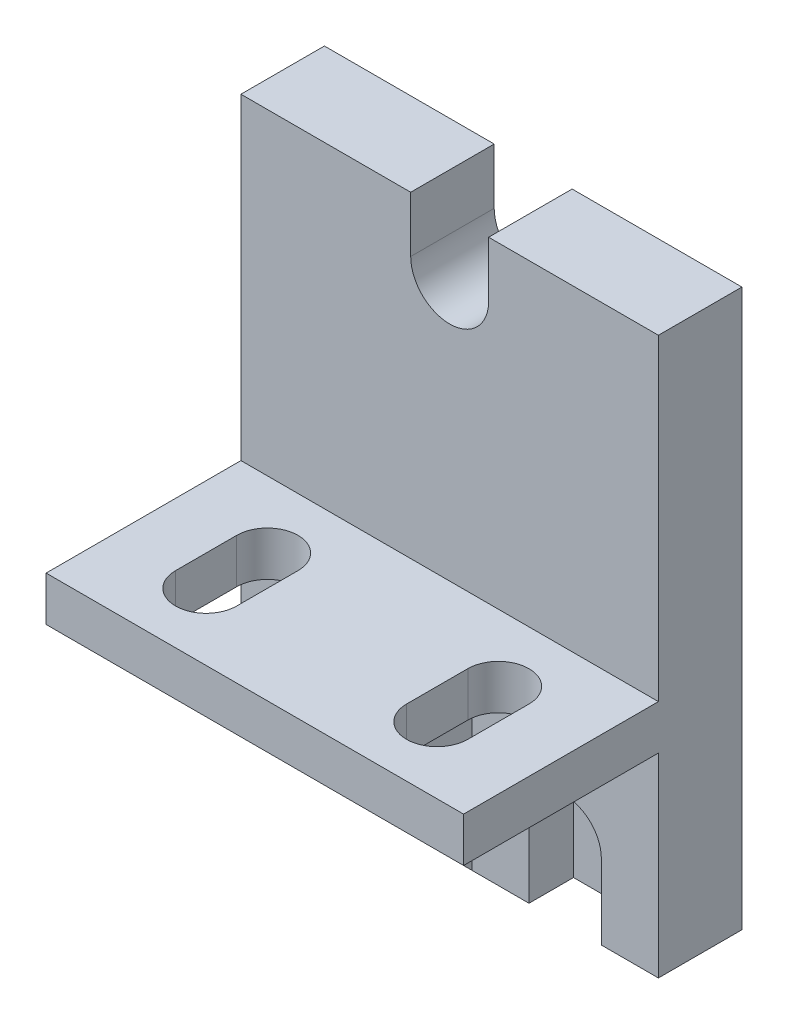
ISO-10303-21;
HEADER;
FILE_DESCRIPTION(('STEP AP214'),'2;1');
FILE_NAME('part.step','',(''),(''),'','','');
FILE_SCHEMA(('AUTOMOTIVE_DESIGN { 1 0 10303 214 1 1 1 1 }'));
ENDSEC;
DATA;
#1=APPLICATION_CONTEXT('core data for automotive mechanical design processes');
#2=APPLICATION_PROTOCOL_DEFINITION('international standard','automotive_design',2000,#1);
#3=PRODUCT_CONTEXT('',#1,'mechanical');
#4=PRODUCT('Part','Part','',(#3));
#5=PRODUCT_RELATED_PRODUCT_CATEGORY('part','',(#4));
#6=PRODUCT_DEFINITION_FORMATION('','',#4);
#7=PRODUCT_DEFINITION_CONTEXT('part definition',#1,'design');
#8=PRODUCT_DEFINITION('design','',#6,#7);
#9=PRODUCT_DEFINITION_SHAPE('','',#8);
#10=(LENGTH_UNIT() NAMED_UNIT(*) SI_UNIT(.MILLI.,.METRE.));
#11=(NAMED_UNIT(*) PLANE_ANGLE_UNIT() SI_UNIT($,.RADIAN.));
#12=(NAMED_UNIT(*) SI_UNIT($,.STERADIAN.) SOLID_ANGLE_UNIT());
#13=UNCERTAINTY_MEASURE_WITH_UNIT(LENGTH_MEASURE(1.E-05),#10,'distance_accuracy_value','');
#14=(GEOMETRIC_REPRESENTATION_CONTEXT(3) GLOBAL_UNCERTAINTY_ASSIGNED_CONTEXT((#13)) GLOBAL_UNIT_ASSIGNED_CONTEXT((#10,
#11,#12)) REPRESENTATION_CONTEXT('',''));
#15=CARTESIAN_POINT('',(0.,0.,0.));
#16=DIRECTION('',(0.,0.,1.));
#17=DIRECTION('',(1.,0.,0.));
#18=AXIS2_PLACEMENT_3D('',#15,#16,#17);
#19=CARTESIAN_POINT('',(0.,0.,15.));
#20=DIRECTION('',(0.,0.,-1.));
#21=DIRECTION('',(-1.,0.,0.));
#22=AXIS2_PLACEMENT_3D('',#19,#20,#21);
#23=PLANE('',#22);
#24=DIRECTION('',(0.,1.,0.));
#25=VECTOR('',#24,1.);
#26=CARTESIAN_POINT('',(-27.25,-63.5,15.));
#27=LINE('',#26,#25);
#28=CARTESIAN_POINT('',(-27.25,-50.,15.));
#29=VERTEX_POINT('',#28);
#30=CARTESIAN_POINT('',(-27.25,-36.5,15.));
#31=VERTEX_POINT('',#30);
#32=EDGE_CURVE('E259',#29,#31,#27,.T.);
#33=ORIENTED_EDGE('',*,*,#32,.T.);
#34=CARTESIAN_POINT('',(-20.75,-36.5,15.));
#35=DIRECTION('',(0.,0.,-1.));
#36=DIRECTION('',(-1.,0.,0.));
#37=AXIS2_PLACEMENT_3D('',#34,#35,#36);
#38=CIRCLE('',#37,6.5);
#39=CARTESIAN_POINT('',(-14.25,-36.5,15.));
#40=VERTEX_POINT('',#39);
#41=EDGE_CURVE('E262',#31,#40,#38,.T.);
#42=ORIENTED_EDGE('',*,*,#41,.T.);
#43=DIRECTION('',(0.,-1.,0.));
#44=VECTOR('',#43,1.);
#45=CARTESIAN_POINT('',(-14.25,-63.5,15.));
#46=LINE('',#45,#44);
#47=CARTESIAN_POINT('',(-14.25,-50.,15.));
#48=VERTEX_POINT('',#47);
#49=EDGE_CURVE('E253',#40,#48,#46,.T.);
#50=ORIENTED_EDGE('',*,*,#49,.T.);
#51=DIRECTION('',(1.,0.,0.));
#52=VECTOR('',#51,1.);
#53=CARTESIAN_POINT('',(-37.5,-50.,15.));
#54=LINE('',#53,#52);
#55=CARTESIAN_POINT('',(-4.,-50.,15.));
#56=VERTEX_POINT('',#55);
#57=EDGE_CURVE('E456',#48,#56,#54,.T.);
#58=ORIENTED_EDGE('',*,*,#57,.T.);
#59=DIRECTION('',(0.,1.,0.));
#60=VECTOR('',#59,1.);
#61=CARTESIAN_POINT('',(-4.,-15.,15.));
#62=LINE('',#61,#60);
#63=CARTESIAN_POINT('',(-4.,-15.,15.));
#64=VERTEX_POINT('',#63);
#65=EDGE_CURVE('E364',#56,#64,#62,.T.);
#66=ORIENTED_EDGE('',*,*,#65,.T.);
#67=DIRECTION('',(1.,0.,0.));
#68=VECTOR('',#67,1.);
#69=CARTESIAN_POINT('',(-37.5,-15.,15.));
#70=LINE('',#69,#68);
#71=CARTESIAN_POINT('',(-37.5,-15.,15.));
#72=VERTEX_POINT('',#71);
#73=EDGE_CURVE('E386',#72,#64,#70,.T.);
#74=ORIENTED_EDGE('',*,*,#73,.F.);
#75=DIRECTION('',(0.,-1.,0.));
#76=VECTOR('',#75,1.);
#77=CARTESIAN_POINT('',(-37.5,-50.,15.));
#78=LINE('',#77,#76);
#79=CARTESIAN_POINT('',(-37.5,-50.,15.));
#80=VERTEX_POINT('',#79);
#81=EDGE_CURVE('E404',#72,#80,#78,.T.);
#82=ORIENTED_EDGE('',*,*,#81,.T.);
#83=EDGE_CURVE('E461',#80,#29,#54,.T.);
#84=ORIENTED_EDGE('',*,*,#83,.T.);
#85=EDGE_LOOP('',(#33,#42,#50,#58,#66,#74,#82,#84));
#86=FACE_BOUND('',#85,.T.);
#87=ADVANCED_FACE('F37',(#86),#23,.F.);
#88=CARTESIAN_POINT('',(-37.5,-50.,15.));
#89=DIRECTION('',(0.,1.,0.));
#90=DIRECTION('',(0.,0.,1.));
#91=AXIS2_PLACEMENT_3D('',#88,#89,#90);
#92=PLANE('',#91);
#93=DIRECTION('',(0.,0.,-1.));
#94=VECTOR('',#93,1.);
#95=CARTESIAN_POINT('',(-27.25,-50.,15.));
#96=LINE('',#95,#94);
#97=CARTESIAN_POINT('',(-27.25,-50.,7.));
#98=VERTEX_POINT('',#97);
#99=EDGE_CURVE('E11',#29,#98,#96,.T.);
#100=ORIENTED_EDGE('',*,*,#99,.F.);
#101=ORIENTED_EDGE('',*,*,#83,.F.);
#102=DIRECTION('',(0.,0.,-1.));
#103=VECTOR('',#102,1.);
#104=CARTESIAN_POINT('',(-37.5,-50.,15.));
#105=LINE('',#104,#103);
#106=CARTESIAN_POINT('',(-37.5,-50.,0.));
#107=VERTEX_POINT('',#106);
#108=EDGE_CURVE('E495',#80,#107,#105,.T.);
#109=ORIENTED_EDGE('',*,*,#108,.T.);
#110=DIRECTION('',(1.,0.,0.));
#111=VECTOR('',#110,1.);
#112=CARTESIAN_POINT('',(-37.5,-50.,0.));
#113=LINE('',#112,#111);
#114=CARTESIAN_POINT('',(37.5,-50.,0.));
#115=VERTEX_POINT('',#114);
#116=EDGE_CURVE('E500',#107,#115,#113,.T.);
#117=ORIENTED_EDGE('',*,*,#116,.T.);
#118=DIRECTION('',(0.,0.,-1.));
#119=VECTOR('',#118,1.);
#120=CARTESIAN_POINT('',(37.5,-50.,15.));
#121=LINE('',#120,#119);
#122=CARTESIAN_POINT('',(37.5,-50.,15.));
#123=VERTEX_POINT('',#122);
#124=EDGE_CURVE('E466',#123,#115,#121,.T.);
#125=ORIENTED_EDGE('',*,*,#124,.F.);
#126=CARTESIAN_POINT('',(27.25,-50.,15.));
#127=VERTEX_POINT('',#126);
#128=EDGE_CURVE('E464',#127,#123,#54,.T.);
#129=ORIENTED_EDGE('',*,*,#128,.F.);
#130=DIRECTION('',(0.,0.,-1.));
#131=VECTOR('',#130,1.);
#132=CARTESIAN_POINT('',(27.25,-50.,15.));
#133=LINE('',#132,#131);
#134=CARTESIAN_POINT('',(27.25,-50.,7.));
#135=VERTEX_POINT('',#134);
#136=EDGE_CURVE('E445',#127,#135,#133,.T.);
#137=ORIENTED_EDGE('',*,*,#136,.T.);
#138=DIRECTION('',(1.,0.,0.));
#139=VECTOR('',#138,1.);
#140=CARTESIAN_POINT('',(-37.5,-50.,7.));
#141=LINE('',#140,#139);
#142=CARTESIAN_POINT('',(14.25,-50.,7.));
#143=VERTEX_POINT('',#142);
#144=EDGE_CURVE('E443',#143,#135,#141,.T.);
#145=ORIENTED_EDGE('',*,*,#144,.F.);
#146=DIRECTION('',(0.,0.,1.));
#147=VECTOR('',#146,1.);
#148=CARTESIAN_POINT('',(14.25,-50.,15.));
#149=LINE('',#148,#147);
#150=CARTESIAN_POINT('',(14.25,-50.,15.));
#151=VERTEX_POINT('',#150);
#152=EDGE_CURVE('E448',#143,#151,#149,.T.);
#153=ORIENTED_EDGE('',*,*,#152,.T.);
#154=CARTESIAN_POINT('',(4.,-50.,15.));
#155=VERTEX_POINT('',#154);
#156=EDGE_CURVE('E462',#155,#151,#54,.T.);
#157=ORIENTED_EDGE('',*,*,#156,.F.);
#158=DIRECTION('',(-1.,0.,0.));
#159=VECTOR('',#158,1.);
#160=CARTESIAN_POINT('',(4.,-50.,15.));
#161=LINE('',#160,#159);
#162=EDGE_CURVE('E368',#155,#56,#161,.T.);
#163=ORIENTED_EDGE('',*,*,#162,.T.);
#164=ORIENTED_EDGE('',*,*,#57,.F.);
#165=DIRECTION('',(0.,0.,1.));
#166=VECTOR('',#165,1.);
#167=CARTESIAN_POINT('',(-14.25,-50.,15.));
#168=LINE('',#167,#166);
#169=CARTESIAN_POINT('',(-14.25,-50.,7.));
#170=VERTEX_POINT('',#169);
#171=EDGE_CURVE('E45',#170,#48,#168,.T.);
#172=ORIENTED_EDGE('',*,*,#171,.F.);
#173=DIRECTION('',(1.,0.,0.));
#174=VECTOR('',#173,1.);
#175=CARTESIAN_POINT('',(-37.5,-50.,7.));
#176=LINE('',#175,#174);
#177=EDGE_CURVE('E258',#98,#170,#176,.T.);
#178=ORIENTED_EDGE('',*,*,#177,.F.);
#179=EDGE_LOOP('',(#100,#101,#109,#117,#125,#129,#137,#145,#153,#157,#163,#164,#172,#178));
#180=FACE_BOUND('',#179,.T.);
#181=ADVANCED_FACE('F458',(#180),#92,.F.);
#182=CARTESIAN_POINT('',(-37.5,-6.99999999999999,50.));
#183=DIRECTION('',(0.,-1.,0.));
#184=DIRECTION('',(0.,0.,-1.));
#185=AXIS2_PLACEMENT_3D('',#182,#183,#184);
#186=PLANE('',#185);
#187=DIRECTION('',(-1.,0.,0.));
#188=VECTOR('',#187,1.);
#189=CARTESIAN_POINT('',(-37.5,-6.99999999999999,15.));
#190=LINE('',#189,#188);
#191=CARTESIAN_POINT('',(37.5,-6.99999999999999,15.));
#192=VERTEX_POINT('',#191);
#193=CARTESIAN_POINT('',(-37.5,-6.99999999999999,15.));
#194=VERTEX_POINT('',#193);
#195=EDGE_CURVE('E381',#192,#194,#190,.T.);
#196=ORIENTED_EDGE('',*,*,#195,.T.);
#197=DIRECTION('',(0.,0.,-1.));
#198=VECTOR('',#197,1.);
#199=CARTESIAN_POINT('',(-37.5,-6.99999999999999,50.));
#200=LINE('',#199,#198);
#201=CARTESIAN_POINT('',(-37.5,-6.99999999999999,50.));
#202=VERTEX_POINT('',#201);
#203=EDGE_CURVE('E407',#202,#194,#200,.T.);
#204=ORIENTED_EDGE('',*,*,#203,.F.);
#205=DIRECTION('',(-1.,0.,0.));
#206=VECTOR('',#205,1.);
#207=CARTESIAN_POINT('',(-37.5,-6.99999999999999,50.));
#208=LINE('',#207,#206);
#209=CARTESIAN_POINT('',(37.5,-6.99999999999999,50.));
#210=VERTEX_POINT('',#209);
#211=EDGE_CURVE('E385',#210,#202,#208,.T.);
#212=ORIENTED_EDGE('',*,*,#211,.F.);
#213=DIRECTION('',(0.,0.,-1.));
#214=VECTOR('',#213,1.);
#215=CARTESIAN_POINT('',(37.5,-6.99999999999999,50.));
#216=LINE('',#215,#214);
#217=EDGE_CURVE('E410',#210,#192,#216,.T.);
#218=ORIENTED_EDGE('',*,*,#217,.T.);
#219=EDGE_LOOP('',(#196,#204,#212,#218));
#220=FACE_BOUND('',#219,.T.);
#221=DIRECTION('',(0.,0.,-1.));
#222=VECTOR('',#221,1.);
#223=CARTESIAN_POINT('',(15.25,-6.99999999999999,50.));
#224=LINE('',#223,#222);
#225=CARTESIAN_POINT('',(15.25,-6.99999999999999,38.));
#226=VERTEX_POINT('',#225);
#227=CARTESIAN_POINT('',(15.25,-6.99999999999999,27.));
#228=VERTEX_POINT('',#227);
#229=EDGE_CURVE('E437',#226,#228,#224,.T.);
#230=ORIENTED_EDGE('',*,*,#229,.T.);
#231=CARTESIAN_POINT('',(20.75,-6.99999999999999,27.));
#232=DIRECTION('',(0.,-1.,0.));
#233=DIRECTION('',(0.,0.,-1.));
#234=AXIS2_PLACEMENT_3D('',#231,#232,#233);
#235=CIRCLE('',#234,5.5);
#236=CARTESIAN_POINT('',(26.25,-6.99999999999999,27.));
#237=VERTEX_POINT('',#236);
#238=EDGE_CURVE('E440',#228,#237,#235,.T.);
#239=ORIENTED_EDGE('',*,*,#238,.T.);
#240=DIRECTION('',(0.,0.,1.));
#241=VECTOR('',#240,1.);
#242=CARTESIAN_POINT('',(26.25,-6.99999999999999,50.));
#243=LINE('',#242,#241);
#244=CARTESIAN_POINT('',(26.25,-6.99999999999999,38.));
#245=VERTEX_POINT('',#244);
#246=EDGE_CURVE('E430',#237,#245,#243,.T.);
#247=ORIENTED_EDGE('',*,*,#246,.T.);
#248=CARTESIAN_POINT('',(20.75,-6.99999999999999,38.));
#249=DIRECTION('',(0.,-1.,0.));
#250=DIRECTION('',(0.,0.,-1.));
#251=AXIS2_PLACEMENT_3D('',#248,#249,#250);
#252=CIRCLE('',#251,5.5);
#253=EDGE_CURVE('E433',#245,#226,#252,.T.);
#254=ORIENTED_EDGE('',*,*,#253,.T.);
#255=EDGE_LOOP('',(#230,#239,#247,#254));
#256=FACE_BOUND('',#255,.T.);
#257=CARTESIAN_POINT('',(-20.75,-6.99999999999999,27.));
#258=DIRECTION('',(0.,-1.,0.));
#259=DIRECTION('',(0.,0.,-1.));
#260=AXIS2_PLACEMENT_3D('',#257,#258,#259);
#261=CIRCLE('',#260,5.5);
#262=CARTESIAN_POINT('',(-15.25,-6.99999999999999,27.));
#263=VERTEX_POINT('',#262);
#264=CARTESIAN_POINT('',(-26.25,-6.99999999999999,27.));
#265=VERTEX_POINT('',#264);
#266=EDGE_CURVE('E295',#263,#265,#261,.F.);
#267=ORIENTED_EDGE('',*,*,#266,.F.);
#268=DIRECTION('',(0.,0.,-1.));
#269=VECTOR('',#268,1.);
#270=CARTESIAN_POINT('',(-15.25,-6.99999999999999,50.));
#271=LINE('',#270,#269);
#272=CARTESIAN_POINT('',(-15.25,-6.99999999999999,38.));
#273=VERTEX_POINT('',#272);
#274=EDGE_CURVE('E284',#273,#263,#271,.T.);
#275=ORIENTED_EDGE('',*,*,#274,.F.);
#276=CARTESIAN_POINT('',(-20.75,-6.99999999999999,38.));
#277=DIRECTION('',(0.,-1.,0.));
#278=DIRECTION('',(0.,0.,-1.));
#279=AXIS2_PLACEMENT_3D('',#276,#277,#278);
#280=CIRCLE('',#279,5.5);
#281=CARTESIAN_POINT('',(-26.25,-6.99999999999999,38.));
#282=VERTEX_POINT('',#281);
#283=EDGE_CURVE('E291',#282,#273,#280,.F.);
#284=ORIENTED_EDGE('',*,*,#283,.F.);
#285=DIRECTION('',(0.,0.,1.));
#286=VECTOR('',#285,1.);
#287=CARTESIAN_POINT('',(-26.25,-6.99999999999999,50.));
#288=LINE('',#287,#286);
#289=EDGE_CURVE('E293',#265,#282,#288,.T.);
#290=ORIENTED_EDGE('',*,*,#289,.F.);
#291=EDGE_LOOP('',(#267,#275,#284,#290));
#292=FACE_BOUND('',#291,.T.);
#293=ADVANCED_FACE('F571',(#220,#256,#292),#186,.F.);
#294=CARTESIAN_POINT('',(-37.5,-15.,50.));
#295=DIRECTION('',(0.,1.,0.));
#296=DIRECTION('',(0.,0.,1.));
#297=AXIS2_PLACEMENT_3D('',#294,#295,#296);
#298=PLANE('',#297);
#299=ORIENTED_EDGE('',*,*,#73,.T.);
#300=DIRECTION('',(0.,0.,1.));
#301=VECTOR('',#300,1.);
#302=CARTESIAN_POINT('',(-4.,-15.,50.));
#303=LINE('',#302,#301);
#304=CARTESIAN_POINT('',(-4.,-15.,50.));
#305=VERTEX_POINT('',#304);
#306=EDGE_CURVE('E354',#64,#305,#303,.T.);
#307=ORIENTED_EDGE('',*,*,#306,.T.);
#308=DIRECTION('',(1.,0.,0.));
#309=VECTOR('',#308,1.);
#310=CARTESIAN_POINT('',(-37.5,-15.,50.));
#311=LINE('',#310,#309);
#312=CARTESIAN_POINT('',(-37.5,-15.,50.));
#313=VERTEX_POINT('',#312);
#314=EDGE_CURVE('E391',#313,#305,#311,.T.);
#315=ORIENTED_EDGE('',*,*,#314,.F.);
#316=DIRECTION('',(0.,0.,-1.));
#317=VECTOR('',#316,1.);
#318=CARTESIAN_POINT('',(-37.5,-15.,50.));
#319=LINE('',#318,#317);
#320=EDGE_CURVE('E411',#313,#72,#319,.T.);
#321=ORIENTED_EDGE('',*,*,#320,.T.);
#322=EDGE_LOOP('',(#299,#307,#315,#321));
#323=FACE_BOUND('',#322,.T.);
#324=CARTESIAN_POINT('',(-20.75,-15.,27.));
#325=DIRECTION('',(0.,1.,0.));
#326=DIRECTION('',(0.,0.,-1.));
#327=AXIS2_PLACEMENT_3D('',#324,#325,#326);
#328=CIRCLE('',#327,5.5);
#329=CARTESIAN_POINT('',(-15.25,-15.,27.));
#330=VERTEX_POINT('',#329);
#331=CARTESIAN_POINT('',(-26.25,-15.,27.));
#332=VERTEX_POINT('',#331);
#333=EDGE_CURVE('E268',#330,#332,#328,.T.);
#334=ORIENTED_EDGE('',*,*,#333,.T.);
#335=DIRECTION('',(0.,0.,1.));
#336=VECTOR('',#335,1.);
#337=CARTESIAN_POINT('',(-26.25,-15.,27.));
#338=LINE('',#337,#336);
#339=CARTESIAN_POINT('',(-26.25,-15.,38.));
#340=VERTEX_POINT('',#339);
#341=EDGE_CURVE('E278',#332,#340,#338,.T.);
#342=ORIENTED_EDGE('',*,*,#341,.T.);
#343=CARTESIAN_POINT('',(-20.75,-15.,38.));
#344=DIRECTION('',(0.,1.,0.));
#345=DIRECTION('',(0.,0.,-1.));
#346=AXIS2_PLACEMENT_3D('',#343,#344,#345);
#347=CIRCLE('',#346,5.5);
#348=CARTESIAN_POINT('',(-15.25,-15.,38.));
#349=VERTEX_POINT('',#348);
#350=EDGE_CURVE('E275',#340,#349,#347,.T.);
#351=ORIENTED_EDGE('',*,*,#350,.T.);
#352=DIRECTION('',(0.,0.,-1.));
#353=VECTOR('',#352,1.);
#354=CARTESIAN_POINT('',(-15.25,-15.,27.));
#355=LINE('',#354,#353);
#356=EDGE_CURVE('E272',#349,#330,#355,.T.);
#357=ORIENTED_EDGE('',*,*,#356,.T.);
#358=EDGE_LOOP('',(#334,#342,#351,#357));
#359=FACE_BOUND('',#358,.T.);
#360=ADVANCED_FACE('F546',(#323,#359),#298,.F.);
#361=CARTESIAN_POINT('',(-37.5,50.,15.));
#362=DIRECTION('',(0.,-1.,0.));
#363=DIRECTION('',(0.,0.,-1.));
#364=AXIS2_PLACEMENT_3D('',#361,#362,#363);
#365=PLANE('',#364);
#366=DIRECTION('',(-1.,0.,0.));
#367=VECTOR('',#366,1.);
#368=CARTESIAN_POINT('',(-37.5,50.,0.));
#369=LINE('',#368,#367);
#370=CARTESIAN_POINT('',(37.5,50.,0.));
#371=VERTEX_POINT('',#370);
#372=CARTESIAN_POINT('',(7.,50.,0.));
#373=VERTEX_POINT('',#372);
#374=EDGE_CURVE('E504',#371,#373,#369,.T.);
#375=ORIENTED_EDGE('',*,*,#374,.T.);
#376=DIRECTION('',(0.,0.,1.));
#377=VECTOR('',#376,1.);
#378=CARTESIAN_POINT('',(7.,50.,15.));
#379=LINE('',#378,#377);
#380=CARTESIAN_POINT('',(7.,50.,15.));
#381=VERTEX_POINT('',#380);
#382=EDGE_CURVE('E318',#373,#381,#379,.T.);
#383=ORIENTED_EDGE('',*,*,#382,.T.);
#384=DIRECTION('',(-1.,0.,0.));
#385=VECTOR('',#384,1.);
#386=CARTESIAN_POINT('',(-37.5,50.,15.));
#387=LINE('',#386,#385);
#388=CARTESIAN_POINT('',(37.5,50.,15.));
#389=VERTEX_POINT('',#388);
#390=EDGE_CURVE('E477',#389,#381,#387,.T.);
#391=ORIENTED_EDGE('',*,*,#390,.F.);
#392=DIRECTION('',(0.,0.,-1.));
#393=VECTOR('',#392,1.);
#394=CARTESIAN_POINT('',(37.5,50.,15.));
#395=LINE('',#394,#393);
#396=EDGE_CURVE('E434',#389,#371,#395,.T.);
#397=ORIENTED_EDGE('',*,*,#396,.T.);
#398=EDGE_LOOP('',(#375,#383,#391,#397));
#399=FACE_BOUND('',#398,.T.);
#400=ADVANCED_FACE('F576',(#399),#365,.F.);
#401=ORIENTED_EDGE('',*,*,#156,.T.);
#402=DIRECTION('',(0.,-1.,0.));
#403=VECTOR('',#402,1.);
#404=CARTESIAN_POINT('',(14.25,-63.5,15.));
#405=LINE('',#404,#403);
#406=CARTESIAN_POINT('',(14.25,-36.5,15.));
#407=VERTEX_POINT('',#406);
#408=EDGE_CURVE('E325',#407,#151,#405,.T.);
#409=ORIENTED_EDGE('',*,*,#408,.F.);
#410=CARTESIAN_POINT('',(20.75,-36.5,15.));
#411=DIRECTION('',(0.,0.,1.));
#412=DIRECTION('',(1.,0.,0.));
#413=AXIS2_PLACEMENT_3D('',#410,#411,#412);
#414=CIRCLE('',#413,6.5);
#415=CARTESIAN_POINT('',(27.25,-36.5,15.));
#416=VERTEX_POINT('',#415);
#417=EDGE_CURVE('E332',#416,#407,#414,.T.);
#418=ORIENTED_EDGE('',*,*,#417,.F.);
#419=DIRECTION('',(0.,1.,0.));
#420=VECTOR('',#419,1.);
#421=CARTESIAN_POINT('',(27.25,-63.5,15.));
#422=LINE('',#421,#420);
#423=EDGE_CURVE('E321',#127,#416,#422,.T.);
#424=ORIENTED_EDGE('',*,*,#423,.F.);
#425=ORIENTED_EDGE('',*,*,#128,.T.);
#426=DIRECTION('',(0.,1.,0.));
#427=VECTOR('',#426,1.);
#428=CARTESIAN_POINT('',(37.5,-50.,15.));
#429=LINE('',#428,#427);
#430=CARTESIAN_POINT('',(37.5,-15.,15.));
#431=VERTEX_POINT('',#430);
#432=EDGE_CURVE('E488',#123,#431,#429,.T.);
#433=ORIENTED_EDGE('',*,*,#432,.T.);
#434=CARTESIAN_POINT('',(4.,-15.,15.));
#435=VERTEX_POINT('',#434);
#436=EDGE_CURVE('E403',#435,#431,#70,.T.);
#437=ORIENTED_EDGE('',*,*,#436,.F.);
#438=DIRECTION('',(0.,1.,0.));
#439=VECTOR('',#438,1.);
#440=CARTESIAN_POINT('',(4.,-15.,15.));
#441=LINE('',#440,#439);
#442=EDGE_CURVE('E366',#155,#435,#441,.T.);
#443=ORIENTED_EDGE('',*,*,#442,.F.);
#444=EDGE_LOOP('',(#401,#409,#418,#424,#425,#433,#437,#443));
#445=FACE_BOUND('',#444,.T.);
#446=ADVANCED_FACE('F529',(#445),#23,.F.);
#447=DIRECTION('',(0.,0.,1.));
#448=VECTOR('',#447,1.);
#449=CARTESIAN_POINT('',(26.25,-15.,27.));
#450=LINE('',#449,#448);
#451=CARTESIAN_POINT('',(26.25,-15.,27.));
#452=VERTEX_POINT('',#451);
#453=CARTESIAN_POINT('',(26.25,-15.,38.));
#454=VERTEX_POINT('',#453);
#455=EDGE_CURVE('E342',#452,#454,#450,.T.);
#456=ORIENTED_EDGE('',*,*,#455,.F.);
#457=CARTESIAN_POINT('',(20.75,-15.,27.));
#458=DIRECTION('',(0.,-1.,0.));
#459=DIRECTION('',(0.,0.,-1.));
#460=AXIS2_PLACEMENT_3D('',#457,#458,#459);
#461=CIRCLE('',#460,5.5);
#462=CARTESIAN_POINT('',(15.25,-15.,27.));
#463=VERTEX_POINT('',#462);
#464=EDGE_CURVE('E338',#463,#452,#461,.T.);
#465=ORIENTED_EDGE('',*,*,#464,.F.);
#466=DIRECTION('',(0.,0.,-1.));
#467=VECTOR('',#466,1.);
#468=CARTESIAN_POINT('',(15.25,-15.,27.));
#469=LINE('',#468,#467);
#470=CARTESIAN_POINT('',(15.25,-15.,38.));
#471=VERTEX_POINT('',#470);
#472=EDGE_CURVE('E348',#471,#463,#469,.T.);
#473=ORIENTED_EDGE('',*,*,#472,.F.);
#474=CARTESIAN_POINT('',(20.75,-15.,38.));
#475=DIRECTION('',(0.,-1.,0.));
#476=DIRECTION('',(0.,0.,-1.));
#477=AXIS2_PLACEMENT_3D('',#474,#475,#476);
#478=CIRCLE('',#477,5.5);
#479=EDGE_CURVE('E345',#454,#471,#478,.T.);
#480=ORIENTED_EDGE('',*,*,#479,.F.);
#481=EDGE_LOOP('',(#456,#465,#473,#480));
#482=FACE_BOUND('',#481,.T.);
#483=DIRECTION('',(0.,0.,1.));
#484=VECTOR('',#483,1.);
#485=CARTESIAN_POINT('',(4.,-15.,50.));
#486=LINE('',#485,#484);
#487=CARTESIAN_POINT('',(4.,-15.,50.));
#488=VERTEX_POINT('',#487);
#489=EDGE_CURVE('E361',#435,#488,#486,.T.);
#490=ORIENTED_EDGE('',*,*,#489,.F.);
#491=ORIENTED_EDGE('',*,*,#436,.T.);
#492=DIRECTION('',(0.,0.,-1.));
#493=VECTOR('',#492,1.);
#494=CARTESIAN_POINT('',(37.5,-15.,50.));
#495=LINE('',#494,#493);
#496=CARTESIAN_POINT('',(37.5,-15.,50.));
#497=VERTEX_POINT('',#496);
#498=EDGE_CURVE('E394',#497,#431,#495,.T.);
#499=ORIENTED_EDGE('',*,*,#498,.F.);
#500=EDGE_CURVE('E390',#488,#497,#311,.T.);
#501=ORIENTED_EDGE('',*,*,#500,.F.);
#502=EDGE_LOOP('',(#490,#491,#499,#501));
#503=FACE_BOUND('',#502,.T.);
#504=ADVANCED_FACE('F533',(#482,#503),#298,.F.);
#505=ORIENTED_EDGE('',*,*,#390,.T.);
#506=DIRECTION('',(0.,1.,0.));
#507=VECTOR('',#506,1.);
#508=CARTESIAN_POINT('',(7.,60.,15.));
#509=LINE('',#508,#507);
#510=CARTESIAN_POINT('',(7.,40.,15.));
#511=VERTEX_POINT('',#510);
#512=EDGE_CURVE('E302',#511,#381,#509,.T.);
#513=ORIENTED_EDGE('',*,*,#512,.F.);
#514=CARTESIAN_POINT('',(0.,40.,15.));
#515=DIRECTION('',(0.,0.,1.));
#516=DIRECTION('',(1.,0.,0.));
#517=AXIS2_PLACEMENT_3D('',#514,#515,#516);
#518=CIRCLE('',#517,7.);
#519=CARTESIAN_POINT('',(-7.,40.,15.));
#520=VERTEX_POINT('',#519);
#521=EDGE_CURVE('E307',#520,#511,#518,.T.);
#522=ORIENTED_EDGE('',*,*,#521,.F.);
#523=DIRECTION('',(0.,-1.,0.));
#524=VECTOR('',#523,1.);
#525=CARTESIAN_POINT('',(-7.,60.,15.));
#526=LINE('',#525,#524);
#527=CARTESIAN_POINT('',(-7.,50.,15.));
#528=VERTEX_POINT('',#527);
#529=EDGE_CURVE('E297',#528,#520,#526,.T.);
#530=ORIENTED_EDGE('',*,*,#529,.F.);
#531=CARTESIAN_POINT('',(-37.5,50.,15.));
#532=VERTEX_POINT('',#531);
#533=EDGE_CURVE('E485',#528,#532,#387,.T.);
#534=ORIENTED_EDGE('',*,*,#533,.T.);
#535=EDGE_CURVE('E469',#532,#194,#78,.T.);
#536=ORIENTED_EDGE('',*,*,#535,.T.);
#537=ORIENTED_EDGE('',*,*,#195,.F.);
#538=EDGE_CURVE('E479',#192,#389,#429,.T.);
#539=ORIENTED_EDGE('',*,*,#538,.T.);
#540=EDGE_LOOP('',(#505,#513,#522,#530,#534,#536,#537,#539));
#541=FACE_BOUND('',#540,.T.);
#542=ADVANCED_FACE('F567',(#541),#23,.F.);
#543=CARTESIAN_POINT('',(37.5,-50.,15.));
#544=DIRECTION('',(-1.,0.,0.));
#545=DIRECTION('',(0.,0.,1.));
#546=AXIS2_PLACEMENT_3D('',#543,#544,#545);
#547=PLANE('',#546);
#548=DIRECTION('',(0.,1.,0.));
#549=VECTOR('',#548,1.);
#550=CARTESIAN_POINT('',(37.5,-50.,0.));
#551=LINE('',#550,#549);
#552=EDGE_CURVE('E416',#115,#371,#551,.T.);
#553=ORIENTED_EDGE('',*,*,#552,.T.);
#554=ORIENTED_EDGE('',*,*,#396,.F.);
#555=ORIENTED_EDGE('',*,*,#538,.F.);
#556=ORIENTED_EDGE('',*,*,#217,.F.);
#557=DIRECTION('',(0.,1.,0.));
#558=VECTOR('',#557,1.);
#559=CARTESIAN_POINT('',(37.5,-15.,50.));
#560=LINE('',#559,#558);
#561=EDGE_CURVE('E382',#497,#210,#560,.T.);
#562=ORIENTED_EDGE('',*,*,#561,.F.);
#563=ORIENTED_EDGE('',*,*,#498,.T.);
#564=ORIENTED_EDGE('',*,*,#432,.F.);
#565=ORIENTED_EDGE('',*,*,#124,.T.);
#566=EDGE_LOOP('',(#553,#554,#555,#556,#562,#563,#564,#565));
#567=FACE_BOUND('',#566,.T.);
#568=ADVANCED_FACE('F39',(#567),#547,.F.);
#569=ORIENTED_EDGE('',*,*,#533,.F.);
#570=DIRECTION('',(0.,0.,-1.));
#571=VECTOR('',#570,1.);
#572=CARTESIAN_POINT('',(-7.,50.,15.));
#573=LINE('',#572,#571);
#574=CARTESIAN_POINT('',(-7.,50.,0.));
#575=VERTEX_POINT('',#574);
#576=EDGE_CURVE('E313',#528,#575,#573,.T.);
#577=ORIENTED_EDGE('',*,*,#576,.T.);
#578=CARTESIAN_POINT('',(-37.5,50.,0.));
#579=VERTEX_POINT('',#578);
#580=EDGE_CURVE('E506',#575,#579,#369,.T.);
#581=ORIENTED_EDGE('',*,*,#580,.T.);
#582=DIRECTION('',(0.,0.,-1.));
#583=VECTOR('',#582,1.);
#584=CARTESIAN_POINT('',(-37.5,50.,15.));
#585=LINE('',#584,#583);
#586=EDGE_CURVE('E492',#532,#579,#585,.T.);
#587=ORIENTED_EDGE('',*,*,#586,.F.);
#588=EDGE_LOOP('',(#569,#577,#581,#587));
#589=FACE_BOUND('',#588,.T.);
#590=ADVANCED_FACE('F515',(#589),#365,.F.);
#591=CARTESIAN_POINT('',(-37.5,-50.,15.));
#592=DIRECTION('',(1.,0.,0.));
#593=DIRECTION('',(0.,0.,-1.));
#594=AXIS2_PLACEMENT_3D('',#591,#592,#593);
#595=PLANE('',#594);
#596=DIRECTION('',(0.,-1.,0.));
#597=VECTOR('',#596,1.);
#598=CARTESIAN_POINT('',(-37.5,-50.,0.));
#599=LINE('',#598,#597);
#600=EDGE_CURVE('E502',#579,#107,#599,.T.);
#601=ORIENTED_EDGE('',*,*,#600,.T.);
#602=ORIENTED_EDGE('',*,*,#108,.F.);
#603=ORIENTED_EDGE('',*,*,#81,.F.);
#604=ORIENTED_EDGE('',*,*,#320,.F.);
#605=DIRECTION('',(0.,-1.,0.));
#606=VECTOR('',#605,1.);
#607=CARTESIAN_POINT('',(-37.5,-15.,50.));
#608=LINE('',#607,#606);
#609=EDGE_CURVE('E388',#202,#313,#608,.T.);
#610=ORIENTED_EDGE('',*,*,#609,.F.);
#611=ORIENTED_EDGE('',*,*,#203,.T.);
#612=ORIENTED_EDGE('',*,*,#535,.F.);
#613=ORIENTED_EDGE('',*,*,#586,.T.);
#614=EDGE_LOOP('',(#601,#602,#603,#604,#610,#611,#612,#613));
#615=FACE_BOUND('',#614,.T.);
#616=ADVANCED_FACE('F520',(#615),#595,.F.);
#617=CARTESIAN_POINT('',(0.,0.,0.));
#618=DIRECTION('',(0.,0.,-1.));
#619=DIRECTION('',(-1.,0.,0.));
#620=AXIS2_PLACEMENT_3D('',#617,#618,#619);
#621=PLANE('',#620);
#622=DIRECTION('',(0.,1.,0.));
#623=VECTOR('',#622,1.);
#624=CARTESIAN_POINT('',(7.,60.,0.));
#625=LINE('',#624,#623);
#626=CARTESIAN_POINT('',(7.,40.,0.));
#627=VERTEX_POINT('',#626);
#628=EDGE_CURVE('E301',#627,#373,#625,.T.);
#629=ORIENTED_EDGE('',*,*,#628,.T.);
#630=ORIENTED_EDGE('',*,*,#374,.F.);
#631=ORIENTED_EDGE('',*,*,#552,.F.);
#632=ORIENTED_EDGE('',*,*,#116,.F.);
#633=ORIENTED_EDGE('',*,*,#600,.F.);
#634=ORIENTED_EDGE('',*,*,#580,.F.);
#635=DIRECTION('',(0.,1.,0.));
#636=VECTOR('',#635,1.);
#637=CARTESIAN_POINT('',(-6.99999999999999,0.,0.));
#638=LINE('',#637,#636);
#639=CARTESIAN_POINT('',(-7.,40.,0.));
#640=VERTEX_POINT('',#639);
#641=EDGE_CURVE('E451',#640,#575,#638,.T.);
#642=ORIENTED_EDGE('',*,*,#641,.F.);
#643=CARTESIAN_POINT('',(0.,40.,0.));
#644=DIRECTION('',(0.,0.,1.));
#645=DIRECTION('',(1.,0.,0.));
#646=AXIS2_PLACEMENT_3D('',#643,#644,#645);
#647=CIRCLE('',#646,7.);
#648=EDGE_CURVE('E298',#640,#627,#647,.T.);
#649=ORIENTED_EDGE('',*,*,#648,.T.);
#650=EDGE_LOOP('',(#629,#630,#631,#632,#633,#634,#642,#649));
#651=FACE_BOUND('',#650,.T.);
#652=ADVANCED_FACE('F523',(#651),#621,.T.);
#653=CARTESIAN_POINT('',(0.,0.,50.));
#654=DIRECTION('',(0.,0.,-1.));
#655=DIRECTION('',(-1.,0.,0.));
#656=AXIS2_PLACEMENT_3D('',#653,#654,#655);
#657=PLANE('',#656);
#658=ORIENTED_EDGE('',*,*,#561,.T.);
#659=ORIENTED_EDGE('',*,*,#211,.T.);
#660=ORIENTED_EDGE('',*,*,#609,.T.);
#661=ORIENTED_EDGE('',*,*,#314,.T.);
#662=DIRECTION('',(-1.,0.,0.));
#663=VECTOR('',#662,1.);
#664=CARTESIAN_POINT('',(4.,-15.,50.));
#665=LINE('',#664,#663);
#666=EDGE_CURVE('E378',#488,#305,#665,.T.);
#667=ORIENTED_EDGE('',*,*,#666,.F.);
#668=ORIENTED_EDGE('',*,*,#500,.T.);
#669=EDGE_LOOP('',(#658,#659,#660,#661,#667,#668));
#670=FACE_BOUND('',#669,.T.);
#671=ADVANCED_FACE('F594',(#670),#657,.F.);
#672=CARTESIAN_POINT('',(4.,-15.,50.));
#673=DIRECTION('',(0.,0.707106781186547,-0.707106781186547));
#674=DIRECTION('',(0.,0.707106781186548,0.707106781186548));
#675=AXIS2_PLACEMENT_3D('',#672,#673,#674);
#676=PLANE('',#675);
#677=DIRECTION('',(0.,-0.707106781186548,-0.707106781186548));
#678=VECTOR('',#677,1.);
#679=CARTESIAN_POINT('',(-4.,-15.,50.));
#680=LINE('',#679,#678);
#681=EDGE_CURVE('E371',#305,#56,#680,.T.);
#682=ORIENTED_EDGE('',*,*,#681,.T.);
#683=ORIENTED_EDGE('',*,*,#162,.F.);
#684=DIRECTION('',(0.,-0.707106781186548,-0.707106781186548));
#685=VECTOR('',#684,1.);
#686=CARTESIAN_POINT('',(4.,-15.,50.));
#687=LINE('',#686,#685);
#688=EDGE_CURVE('E363',#488,#155,#687,.T.);
#689=ORIENTED_EDGE('',*,*,#688,.F.);
#690=ORIENTED_EDGE('',*,*,#666,.T.);
#691=EDGE_LOOP('',(#682,#683,#689,#690));
#692=FACE_BOUND('',#691,.T.);
#693=ADVANCED_FACE('F540',(#692),#676,.F.);
#694=CARTESIAN_POINT('',(4.,0.,0.));
#695=DIRECTION('',(-1.,0.,0.));
#696=DIRECTION('',(0.,0.,1.));
#697=AXIS2_PLACEMENT_3D('',#694,#695,#696);
#698=PLANE('',#697);
#699=ORIENTED_EDGE('',*,*,#489,.T.);
#700=ORIENTED_EDGE('',*,*,#688,.T.);
#701=ORIENTED_EDGE('',*,*,#442,.T.);
#702=EDGE_LOOP('',(#699,#700,#701));
#703=FACE_BOUND('',#702,.T.);
#704=ADVANCED_FACE('F538',(#703),#698,.F.);
#705=CARTESIAN_POINT('',(-4.,0.,0.));
#706=DIRECTION('',(-1.,0.,0.));
#707=DIRECTION('',(0.,0.,1.));
#708=AXIS2_PLACEMENT_3D('',#705,#706,#707);
#709=PLANE('',#708);
#710=ORIENTED_EDGE('',*,*,#306,.F.);
#711=ORIENTED_EDGE('',*,*,#65,.F.);
#712=ORIENTED_EDGE('',*,*,#681,.F.);
#713=EDGE_LOOP('',(#710,#711,#712));
#714=FACE_BOUND('',#713,.T.);
#715=ADVANCED_FACE('F543',(#714),#709,.T.);
#716=CARTESIAN_POINT('',(20.75,50.000025,27.));
#717=DIRECTION('',(0.,-1.,0.));
#718=DIRECTION('',(0.,0.,-1.));
#719=AXIS2_PLACEMENT_3D('',#716,#717,#718);
#720=CYLINDRICAL_SURFACE('',#719,5.5);
#721=DIRECTION('',(0.,-1.,0.));
#722=VECTOR('',#721,1.);
#723=CARTESIAN_POINT('',(15.25,50.000025,27.));
#724=LINE('',#723,#722);
#725=EDGE_CURVE('E352',#228,#463,#724,.T.);
#726=ORIENTED_EDGE('',*,*,#725,.T.);
#727=ORIENTED_EDGE('',*,*,#464,.T.);
#728=DIRECTION('',(0.,-1.,0.));
#729=VECTOR('',#728,1.);
#730=CARTESIAN_POINT('',(26.25,50.000025,27.));
#731=LINE('',#730,#729);
#732=EDGE_CURVE('E351',#237,#452,#731,.T.);
#733=ORIENTED_EDGE('',*,*,#732,.F.);
#734=ORIENTED_EDGE('',*,*,#238,.F.);
#735=EDGE_LOOP('',(#726,#727,#733,#734));
#736=FACE_BOUND('',#735,.T.);
#737=ADVANCED_FACE('F641',(#736),#720,.F.);
#738=CARTESIAN_POINT('',(15.25,50.000025,27.));
#739=DIRECTION('',(-1.,0.,0.));
#740=DIRECTION('',(0.,0.,1.));
#741=AXIS2_PLACEMENT_3D('',#738,#739,#740);
#742=PLANE('',#741);
#743=DIRECTION('',(0.,-1.,0.));
#744=VECTOR('',#743,1.);
#745=CARTESIAN_POINT('',(15.25,50.000025,38.));
#746=LINE('',#745,#744);
#747=EDGE_CURVE('E355',#226,#471,#746,.T.);
#748=ORIENTED_EDGE('',*,*,#747,.T.);
#749=ORIENTED_EDGE('',*,*,#472,.T.);
#750=ORIENTED_EDGE('',*,*,#725,.F.);
#751=ORIENTED_EDGE('',*,*,#229,.F.);
#752=EDGE_LOOP('',(#748,#749,#750,#751));
#753=FACE_BOUND('',#752,.T.);
#754=ADVANCED_FACE('F646',(#753),#742,.F.);
#755=CARTESIAN_POINT('',(20.75,50.000025,38.));
#756=DIRECTION('',(0.,-1.,0.));
#757=DIRECTION('',(0.,0.,-1.));
#758=AXIS2_PLACEMENT_3D('',#755,#756,#757);
#759=CYLINDRICAL_SURFACE('',#758,5.5);
#760=DIRECTION('',(0.,-1.,0.));
#761=VECTOR('',#760,1.);
#762=CARTESIAN_POINT('',(26.25,50.000025,38.));
#763=LINE('',#762,#761);
#764=EDGE_CURVE('E357',#245,#454,#763,.T.);
#765=ORIENTED_EDGE('',*,*,#764,.T.);
#766=ORIENTED_EDGE('',*,*,#479,.T.);
#767=ORIENTED_EDGE('',*,*,#747,.F.);
#768=ORIENTED_EDGE('',*,*,#253,.F.);
#769=EDGE_LOOP('',(#765,#766,#767,#768));
#770=FACE_BOUND('',#769,.T.);
#771=ADVANCED_FACE('F656',(#770),#759,.F.);
#772=CARTESIAN_POINT('',(26.25,50.000025,27.));
#773=DIRECTION('',(1.,0.,0.));
#774=DIRECTION('',(0.,0.,-1.));
#775=AXIS2_PLACEMENT_3D('',#772,#773,#774);
#776=PLANE('',#775);
#777=ORIENTED_EDGE('',*,*,#732,.T.);
#778=ORIENTED_EDGE('',*,*,#455,.T.);
#779=ORIENTED_EDGE('',*,*,#764,.F.);
#780=ORIENTED_EDGE('',*,*,#246,.F.);
#781=EDGE_LOOP('',(#777,#778,#779,#780));
#782=FACE_BOUND('',#781,.T.);
#783=ADVANCED_FACE('F665',(#782),#776,.F.);
#784=CARTESIAN_POINT('',(14.25,-63.5,7.));
#785=DIRECTION('',(-1.,0.,0.));
#786=DIRECTION('',(0.,-1.,0.));
#787=AXIS2_PLACEMENT_3D('',#784,#785,#786);
#788=PLANE('',#787);
#789=DIRECTION('',(0.,-1.,0.));
#790=VECTOR('',#789,1.);
#791=CARTESIAN_POINT('',(14.25,-63.5,7.));
#792=LINE('',#791,#790);
#793=CARTESIAN_POINT('',(14.25,-36.5,7.));
#794=VERTEX_POINT('',#793);
#795=EDGE_CURVE('E328',#794,#143,#792,.T.);
#796=ORIENTED_EDGE('',*,*,#795,.F.);
#797=DIRECTION('',(0.,0.,1.));
#798=VECTOR('',#797,1.);
#799=CARTESIAN_POINT('',(14.25,-36.5,7.));
#800=LINE('',#799,#798);
#801=EDGE_CURVE('E336',#794,#407,#800,.T.);
#802=ORIENTED_EDGE('',*,*,#801,.T.);
#803=ORIENTED_EDGE('',*,*,#408,.T.);
#804=ORIENTED_EDGE('',*,*,#152,.F.);
#805=EDGE_LOOP('',(#796,#802,#803,#804));
#806=FACE_BOUND('',#805,.T.);
#807=ADVANCED_FACE('F674',(#806),#788,.F.);
#808=CARTESIAN_POINT('',(27.25,-63.5,7.));
#809=DIRECTION('',(1.,0.,0.));
#810=DIRECTION('',(0.,0.,-1.));
#811=AXIS2_PLACEMENT_3D('',#808,#809,#810);
#812=PLANE('',#811);
#813=ORIENTED_EDGE('',*,*,#423,.T.);
#814=DIRECTION('',(0.,0.,1.));
#815=VECTOR('',#814,1.);
#816=CARTESIAN_POINT('',(27.25,-36.5,7.));
#817=LINE('',#816,#815);
#818=CARTESIAN_POINT('',(27.25,-36.5,7.));
#819=VERTEX_POINT('',#818);
#820=EDGE_CURVE('E330',#819,#416,#817,.T.);
#821=ORIENTED_EDGE('',*,*,#820,.F.);
#822=DIRECTION('',(0.,1.,0.));
#823=VECTOR('',#822,1.);
#824=CARTESIAN_POINT('',(27.25,-63.5,7.));
#825=LINE('',#824,#823);
#826=EDGE_CURVE('E322',#135,#819,#825,.T.);
#827=ORIENTED_EDGE('',*,*,#826,.F.);
#828=ORIENTED_EDGE('',*,*,#136,.F.);
#829=EDGE_LOOP('',(#813,#821,#827,#828));
#830=FACE_BOUND('',#829,.T.);
#831=ADVANCED_FACE('F684',(#830),#812,.F.);
#832=CARTESIAN_POINT('',(20.75,-63.5,7.));
#833=DIRECTION('',(0.,0.,1.));
#834=DIRECTION('',(1.,0.,0.));
#835=AXIS2_PLACEMENT_3D('',#832,#833,#834);
#836=PLANE('',#835);
#837=ORIENTED_EDGE('',*,*,#144,.T.);
#838=ORIENTED_EDGE('',*,*,#826,.T.);
#839=CARTESIAN_POINT('',(20.75,-36.5,7.));
#840=DIRECTION('',(0.,0.,1.));
#841=DIRECTION('',(1.,0.,0.));
#842=AXIS2_PLACEMENT_3D('',#839,#840,#841);
#843=CIRCLE('',#842,6.5);
#844=EDGE_CURVE('E324',#819,#794,#843,.T.);
#845=ORIENTED_EDGE('',*,*,#844,.T.);
#846=ORIENTED_EDGE('',*,*,#795,.T.);
#847=EDGE_LOOP('',(#837,#838,#845,#846));
#848=FACE_BOUND('',#847,.T.);
#849=ADVANCED_FACE('F691',(#848),#836,.T.);
#850=CARTESIAN_POINT('',(20.75,-36.5,7.));
#851=DIRECTION('',(0.,0.,1.));
#852=DIRECTION('',(1.,0.,0.));
#853=AXIS2_PLACEMENT_3D('',#850,#851,#852);
#854=CYLINDRICAL_SURFACE('',#853,6.5);
#855=ORIENTED_EDGE('',*,*,#417,.T.);
#856=ORIENTED_EDGE('',*,*,#801,.F.);
#857=ORIENTED_EDGE('',*,*,#844,.F.);
#858=ORIENTED_EDGE('',*,*,#820,.T.);
#859=EDGE_LOOP('',(#855,#856,#857,#858));
#860=FACE_BOUND('',#859,.T.);
#861=ADVANCED_FACE('F699',(#860),#854,.F.);
#862=CARTESIAN_POINT('',(7.,60.,0.));
#863=DIRECTION('',(1.,0.,0.));
#864=DIRECTION('',(0.,1.,0.));
#865=AXIS2_PLACEMENT_3D('',#862,#863,#864);
#866=PLANE('',#865);
#867=ORIENTED_EDGE('',*,*,#628,.F.);
#868=DIRECTION('',(0.,0.,1.));
#869=VECTOR('',#868,1.);
#870=CARTESIAN_POINT('',(7.,40.,0.));
#871=LINE('',#870,#869);
#872=EDGE_CURVE('E311',#627,#511,#871,.T.);
#873=ORIENTED_EDGE('',*,*,#872,.T.);
#874=ORIENTED_EDGE('',*,*,#512,.T.);
#875=ORIENTED_EDGE('',*,*,#382,.F.);
#876=EDGE_LOOP('',(#867,#873,#874,#875));
#877=FACE_BOUND('',#876,.T.);
#878=ADVANCED_FACE('F706',(#877),#866,.F.);
#879=CARTESIAN_POINT('',(-7.,60.,0.));
#880=DIRECTION('',(-1.,0.,0.));
#881=DIRECTION('',(0.,-1.,0.));
#882=AXIS2_PLACEMENT_3D('',#879,#880,#881);
#883=PLANE('',#882);
#884=ORIENTED_EDGE('',*,*,#529,.T.);
#885=DIRECTION('',(0.,0.,1.));
#886=VECTOR('',#885,1.);
#887=CARTESIAN_POINT('',(-7.,40.,0.));
#888=LINE('',#887,#886);
#889=EDGE_CURVE('E305',#640,#520,#888,.T.);
#890=ORIENTED_EDGE('',*,*,#889,.F.);
#891=ORIENTED_EDGE('',*,*,#641,.T.);
#892=ORIENTED_EDGE('',*,*,#576,.F.);
#893=EDGE_LOOP('',(#884,#890,#891,#892));
#894=FACE_BOUND('',#893,.T.);
#895=ADVANCED_FACE('F714',(#894),#883,.F.);
#896=CARTESIAN_POINT('',(0.,40.,0.));
#897=DIRECTION('',(0.,0.,1.));
#898=DIRECTION('',(1.,0.,0.));
#899=AXIS2_PLACEMENT_3D('',#896,#897,#898);
#900=CYLINDRICAL_SURFACE('',#899,7.);
#901=ORIENTED_EDGE('',*,*,#521,.T.);
#902=ORIENTED_EDGE('',*,*,#872,.F.);
#903=ORIENTED_EDGE('',*,*,#648,.F.);
#904=ORIENTED_EDGE('',*,*,#889,.T.);
#905=EDGE_LOOP('',(#901,#902,#903,#904));
#906=FACE_BOUND('',#905,.T.);
#907=ADVANCED_FACE('F723',(#906),#900,.F.);
#908=CARTESIAN_POINT('',(-20.75,50.000025,27.));
#909=DIRECTION('',(0.,-1.,0.));
#910=DIRECTION('',(0.,0.,-1.));
#911=AXIS2_PLACEMENT_3D('',#908,#909,#910);
#912=CYLINDRICAL_SURFACE('',#911,5.5);
#913=ORIENTED_EDGE('',*,*,#266,.T.);
#914=DIRECTION('',(0.,-1.,0.));
#915=VECTOR('',#914,1.);
#916=CARTESIAN_POINT('',(-26.25,50.000025,27.));
#917=LINE('',#916,#915);
#918=EDGE_CURVE('E282',#265,#332,#917,.T.);
#919=ORIENTED_EDGE('',*,*,#918,.T.);
#920=ORIENTED_EDGE('',*,*,#333,.F.);
#921=DIRECTION('',(0.,-1.,0.));
#922=VECTOR('',#921,1.);
#923=CARTESIAN_POINT('',(-15.25,50.000025,27.));
#924=LINE('',#923,#922);
#925=EDGE_CURVE('E281',#263,#330,#924,.T.);
#926=ORIENTED_EDGE('',*,*,#925,.F.);
#927=EDGE_LOOP('',(#913,#919,#920,#926));
#928=FACE_BOUND('',#927,.T.);
#929=ADVANCED_FACE('F731',(#928),#912,.F.);
#930=CARTESIAN_POINT('',(-26.25,50.000025,27.));
#931=DIRECTION('',(1.,0.,0.));
#932=DIRECTION('',(0.,0.,-1.));
#933=AXIS2_PLACEMENT_3D('',#930,#931,#932);
#934=PLANE('',#933);
#935=ORIENTED_EDGE('',*,*,#289,.T.);
#936=DIRECTION('',(0.,-1.,0.));
#937=VECTOR('',#936,1.);
#938=CARTESIAN_POINT('',(-26.25,50.000025,38.));
#939=LINE('',#938,#937);
#940=EDGE_CURVE('E285',#282,#340,#939,.T.);
#941=ORIENTED_EDGE('',*,*,#940,.T.);
#942=ORIENTED_EDGE('',*,*,#341,.F.);
#943=ORIENTED_EDGE('',*,*,#918,.F.);
#944=EDGE_LOOP('',(#935,#941,#942,#943));
#945=FACE_BOUND('',#944,.T.);
#946=ADVANCED_FACE('F738',(#945),#934,.T.);
#947=CARTESIAN_POINT('',(-20.75,50.000025,38.));
#948=DIRECTION('',(0.,-1.,0.));
#949=DIRECTION('',(0.,0.,-1.));
#950=AXIS2_PLACEMENT_3D('',#947,#948,#949);
#951=CYLINDRICAL_SURFACE('',#950,5.5);
#952=ORIENTED_EDGE('',*,*,#283,.T.);
#953=DIRECTION('',(0.,-1.,0.));
#954=VECTOR('',#953,1.);
#955=CARTESIAN_POINT('',(-15.25,50.000025,38.));
#956=LINE('',#955,#954);
#957=EDGE_CURVE('E59',#273,#349,#956,.T.);
#958=ORIENTED_EDGE('',*,*,#957,.T.);
#959=ORIENTED_EDGE('',*,*,#350,.F.);
#960=ORIENTED_EDGE('',*,*,#940,.F.);
#961=EDGE_LOOP('',(#952,#958,#959,#960));
#962=FACE_BOUND('',#961,.T.);
#963=ADVANCED_FACE('F561',(#962),#951,.F.);
#964=CARTESIAN_POINT('',(-15.25,50.000025,27.));
#965=DIRECTION('',(-1.,0.,0.));
#966=DIRECTION('',(0.,0.,1.));
#967=AXIS2_PLACEMENT_3D('',#964,#965,#966);
#968=PLANE('',#967);
#969=ORIENTED_EDGE('',*,*,#274,.T.);
#970=ORIENTED_EDGE('',*,*,#925,.T.);
#971=ORIENTED_EDGE('',*,*,#356,.F.);
#972=ORIENTED_EDGE('',*,*,#957,.F.);
#973=EDGE_LOOP('',(#969,#970,#971,#972));
#974=FACE_BOUND('',#973,.T.);
#975=ADVANCED_FACE('F554',(#974),#968,.T.);
#976=CARTESIAN_POINT('',(-27.25,-63.5,7.));
#977=DIRECTION('',(1.,0.,0.));
#978=DIRECTION('',(0.,0.,-1.));
#979=AXIS2_PLACEMENT_3D('',#976,#977,#978);
#980=PLANE('',#979);
#981=ORIENTED_EDGE('',*,*,#99,.T.);
#982=DIRECTION('',(0.,1.,0.));
#983=VECTOR('',#982,1.);
#984=CARTESIAN_POINT('',(-27.25,-63.5,7.));
#985=LINE('',#984,#983);
#986=CARTESIAN_POINT('',(-27.25,-36.5,7.));
#987=VERTEX_POINT('',#986);
#988=EDGE_CURVE('E52',#98,#987,#985,.T.);
#989=ORIENTED_EDGE('',*,*,#988,.T.);
#990=DIRECTION('',(0.,0.,1.));
#991=VECTOR('',#990,1.);
#992=CARTESIAN_POINT('',(-27.25,-36.5,7.));
#993=LINE('',#992,#991);
#994=EDGE_CURVE('E244',#987,#31,#993,.T.);
#995=ORIENTED_EDGE('',*,*,#994,.T.);
#996=ORIENTED_EDGE('',*,*,#32,.F.);
#997=EDGE_LOOP('',(#981,#989,#995,#996));
#998=FACE_BOUND('',#997,.T.);
#999=ADVANCED_FACE('F552',(#998),#980,.T.);
#1000=CARTESIAN_POINT('',(-14.25,-63.5,7.));
#1001=DIRECTION('',(-1.,0.,0.));
#1002=DIRECTION('',(0.,-1.,0.));
#1003=AXIS2_PLACEMENT_3D('',#1000,#1001,#1002);
#1004=PLANE('',#1003);
#1005=ORIENTED_EDGE('',*,*,#171,.T.);
#1006=ORIENTED_EDGE('',*,*,#49,.F.);
#1007=DIRECTION('',(0.,0.,1.));
#1008=VECTOR('',#1007,1.);
#1009=CARTESIAN_POINT('',(-14.25,-36.5,7.));
#1010=LINE('',#1009,#1008);
#1011=CARTESIAN_POINT('',(-14.25,-36.5,7.));
#1012=VERTEX_POINT('',#1011);
#1013=EDGE_CURVE('E242',#1012,#40,#1010,.T.);
#1014=ORIENTED_EDGE('',*,*,#1013,.F.);
#1015=DIRECTION('',(0.,-1.,0.));
#1016=VECTOR('',#1015,1.);
#1017=CARTESIAN_POINT('',(-14.25,-63.5,7.));
#1018=LINE('',#1017,#1016);
#1019=EDGE_CURVE('E246',#1012,#170,#1018,.T.);
#1020=ORIENTED_EDGE('',*,*,#1019,.T.);
#1021=EDGE_LOOP('',(#1005,#1006,#1014,#1020));
#1022=FACE_BOUND('',#1021,.T.);
#1023=ADVANCED_FACE('F250',(#1022),#1004,.T.);
#1024=CARTESIAN_POINT('',(-20.75,-63.5,7.));
#1025=DIRECTION('',(0.,0.,1.));
#1026=DIRECTION('',(-1.,0.,0.));
#1027=AXIS2_PLACEMENT_3D('',#1024,#1025,#1026);
#1028=PLANE('',#1027);
#1029=ORIENTED_EDGE('',*,*,#177,.T.);
#1030=ORIENTED_EDGE('',*,*,#1019,.F.);
#1031=CARTESIAN_POINT('',(-20.75,-36.5,7.));
#1032=DIRECTION('',(0.,0.,-1.));
#1033=DIRECTION('',(-1.,0.,0.));
#1034=AXIS2_PLACEMENT_3D('',#1031,#1032,#1033);
#1035=CIRCLE('',#1034,6.5);
#1036=EDGE_CURVE('E238',#987,#1012,#1035,.T.);
#1037=ORIENTED_EDGE('',*,*,#1036,.F.);
#1038=ORIENTED_EDGE('',*,*,#988,.F.);
#1039=EDGE_LOOP('',(#1029,#1030,#1037,#1038));
#1040=FACE_BOUND('',#1039,.T.);
#1041=ADVANCED_FACE('F256',(#1040),#1028,.T.);
#1042=CARTESIAN_POINT('',(-20.75,-36.5,7.));
#1043=DIRECTION('',(0.,0.,1.));
#1044=DIRECTION('',(1.,0.,0.));
#1045=AXIS2_PLACEMENT_3D('',#1042,#1043,#1044);
#1046=CYLINDRICAL_SURFACE('',#1045,6.5);
#1047=ORIENTED_EDGE('',*,*,#41,.F.);
#1048=ORIENTED_EDGE('',*,*,#994,.F.);
#1049=ORIENTED_EDGE('',*,*,#1036,.T.);
#1050=ORIENTED_EDGE('',*,*,#1013,.T.);
#1051=EDGE_LOOP('',(#1047,#1048,#1049,#1050));
#1052=FACE_BOUND('',#1051,.T.);
#1053=ADVANCED_FACE('F241',(#1052),#1046,.F.);
#1054=CLOSED_SHELL('',(#87,#181,#293,#360,#400,#446,#504,#542,#568,#590,#616,#652,#671,#693,
#704,#715,#737,#754,#771,#783,#807,#831,#849,#861,#878,#895,#907,#929,#946,#963,#975,#999,#1023,
#1041,#1053));
#1055=MANIFOLD_SOLID_BREP('B2',#1054);
#1056=ADVANCED_BREP_SHAPE_REPRESENTATION('',(#18,#1055),#14);
#1057=SHAPE_DEFINITION_REPRESENTATION(#9,#1056);
ENDSEC;
END-ISO-10303-21;
